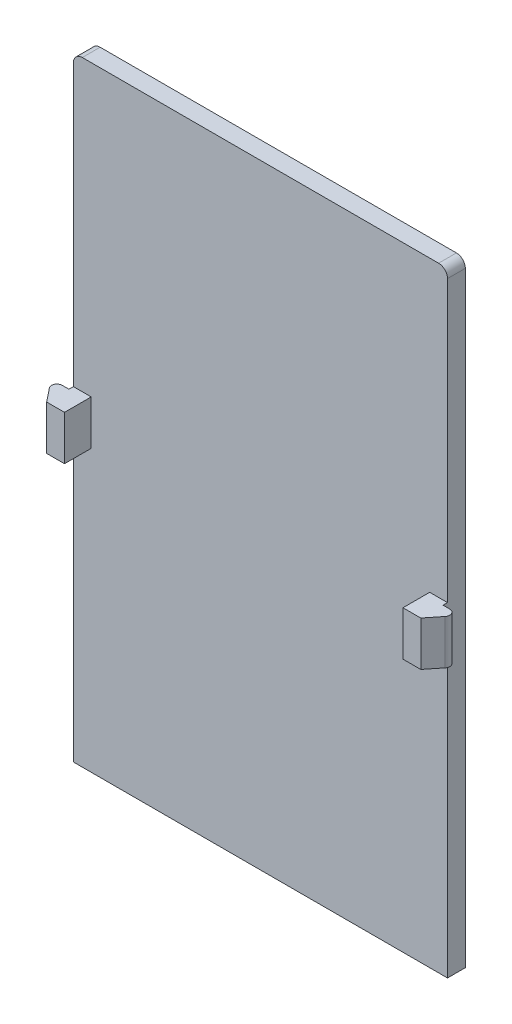
ISO-10303-21;
HEADER;
FILE_DESCRIPTION(('STEP AP214'),'2;1');
FILE_NAME('part.step','',(''),(''),'','','');
FILE_SCHEMA(('AUTOMOTIVE_DESIGN { 1 0 10303 214 1 1 1 1 }'));
ENDSEC;
DATA;
#1=APPLICATION_CONTEXT('core data for automotive mechanical design processes');
#2=APPLICATION_PROTOCOL_DEFINITION('international standard','automotive_design',2000,#1);
#3=PRODUCT_CONTEXT('',#1,'mechanical');
#4=PRODUCT('Part','Part','',(#3));
#5=PRODUCT_RELATED_PRODUCT_CATEGORY('part','',(#4));
#6=PRODUCT_DEFINITION_FORMATION('','',#4);
#7=PRODUCT_DEFINITION_CONTEXT('part definition',#1,'design');
#8=PRODUCT_DEFINITION('design','',#6,#7);
#9=PRODUCT_DEFINITION_SHAPE('','',#8);
#10=(LENGTH_UNIT() NAMED_UNIT(*) SI_UNIT(.MILLI.,.METRE.));
#11=(NAMED_UNIT(*) PLANE_ANGLE_UNIT() SI_UNIT($,.RADIAN.));
#12=(NAMED_UNIT(*) SI_UNIT($,.STERADIAN.) SOLID_ANGLE_UNIT());
#13=UNCERTAINTY_MEASURE_WITH_UNIT(LENGTH_MEASURE(1.E-05),#10,'distance_accuracy_value','');
#14=(GEOMETRIC_REPRESENTATION_CONTEXT(3) GLOBAL_UNCERTAINTY_ASSIGNED_CONTEXT((#13)) GLOBAL_UNIT_ASSIGNED_CONTEXT((#10,
#11,#12)) REPRESENTATION_CONTEXT('',''));
#15=CARTESIAN_POINT('',(0.,0.,0.));
#16=DIRECTION('',(0.,0.,1.));
#17=DIRECTION('',(1.,0.,0.));
#18=AXIS2_PLACEMENT_3D('',#15,#16,#17);
#19=CARTESIAN_POINT('',(0.,0.,2.));
#20=DIRECTION('',(0.,0.,1.));
#21=DIRECTION('',(1.,0.,0.));
#22=AXIS2_PLACEMENT_3D('',#19,#20,#21);
#23=PLANE('',#22);
#24=DIRECTION('',(0.,1.,0.));
#25=VECTOR('',#24,1.);
#26=CARTESIAN_POINT('',(44.,-71.,2.));
#27=LINE('',#26,#25);
#28=CARTESIAN_POINT('',(44.,-34.5,2.));
#29=VERTEX_POINT('',#28);
#30=CARTESIAN_POINT('',(44.,-3.,2.));
#31=VERTEX_POINT('',#30);
#32=EDGE_CURVE('E207',#29,#31,#27,.T.);
#33=ORIENTED_EDGE('',*,*,#32,.T.);
#34=CARTESIAN_POINT('',(43.,-3.,2.));
#35=DIRECTION('',(0.,0.,1.));
#36=DIRECTION('',(1.,0.,0.));
#37=AXIS2_PLACEMENT_3D('',#34,#35,#36);
#38=CIRCLE('',#37,1.);
#39=CARTESIAN_POINT('',(43.,-2.,2.));
#40=VERTEX_POINT('',#39);
#41=EDGE_CURVE('E273',#31,#40,#38,.T.);
#42=ORIENTED_EDGE('',*,*,#41,.T.);
#43=DIRECTION('',(-1.,0.,0.));
#44=VECTOR('',#43,1.);
#45=CARTESIAN_POINT('',(44.,-2.,2.));
#46=LINE('',#45,#44);
#47=CARTESIAN_POINT('',(3.,-2.00000000000001,2.));
#48=VERTEX_POINT('',#47);
#49=EDGE_CURVE('E211',#40,#48,#46,.T.);
#50=ORIENTED_EDGE('',*,*,#49,.T.);
#51=CARTESIAN_POINT('',(3.,-3.00000000000001,2.));
#52=DIRECTION('',(0.,0.,1.));
#53=DIRECTION('',(1.,0.,0.));
#54=AXIS2_PLACEMENT_3D('',#51,#52,#53);
#55=CIRCLE('',#54,1.);
#56=CARTESIAN_POINT('',(2.,-3.,2.));
#57=VERTEX_POINT('',#56);
#58=EDGE_CURVE('E271',#48,#57,#55,.T.);
#59=ORIENTED_EDGE('',*,*,#58,.T.);
#60=DIRECTION('',(0.,-1.,0.));
#61=VECTOR('',#60,1.);
#62=CARTESIAN_POINT('',(2.,-71.,2.));
#63=LINE('',#62,#61);
#64=CARTESIAN_POINT('',(2.,-34.5,2.));
#65=VERTEX_POINT('',#64);
#66=EDGE_CURVE('E215',#57,#65,#63,.T.);
#67=ORIENTED_EDGE('',*,*,#66,.T.);
#68=DIRECTION('',(-1.,0.,0.));
#69=VECTOR('',#68,1.);
#70=CARTESIAN_POINT('',(2.,-34.5,2.));
#71=LINE('',#70,#69);
#72=CARTESIAN_POINT('',(4.,-34.5,2.));
#73=VERTEX_POINT('',#72);
#74=EDGE_CURVE('E242',#73,#65,#71,.T.);
#75=ORIENTED_EDGE('',*,*,#74,.F.);
#76=DIRECTION('',(0.,1.,0.));
#77=VECTOR('',#76,1.);
#78=CARTESIAN_POINT('',(4.,-34.5,2.));
#79=LINE('',#78,#77);
#80=CARTESIAN_POINT('',(4.,-39.5,2.));
#81=VERTEX_POINT('',#80);
#82=EDGE_CURVE('E245',#81,#73,#79,.T.);
#83=ORIENTED_EDGE('',*,*,#82,.F.);
#84=DIRECTION('',(1.,0.,0.));
#85=VECTOR('',#84,1.);
#86=CARTESIAN_POINT('',(2.,-39.5,2.));
#87=LINE('',#86,#85);
#88=CARTESIAN_POINT('',(2.,-39.5,2.));
#89=VERTEX_POINT('',#88);
#90=EDGE_CURVE('E236',#89,#81,#87,.T.);
#91=ORIENTED_EDGE('',*,*,#90,.F.);
#92=CARTESIAN_POINT('',(2.,-71.,2.));
#93=VERTEX_POINT('',#92);
#94=EDGE_CURVE('E214',#89,#93,#63,.T.);
#95=ORIENTED_EDGE('',*,*,#94,.T.);
#96=DIRECTION('',(1.,0.,0.));
#97=VECTOR('',#96,1.);
#98=CARTESIAN_POINT('',(44.,-71.,2.));
#99=LINE('',#98,#97);
#100=CARTESIAN_POINT('',(44.,-71.,2.));
#101=VERTEX_POINT('',#100);
#102=EDGE_CURVE('E204',#93,#101,#99,.T.);
#103=ORIENTED_EDGE('',*,*,#102,.T.);
#104=CARTESIAN_POINT('',(44.,-39.5,2.));
#105=VERTEX_POINT('',#104);
#106=EDGE_CURVE('E208',#101,#105,#27,.T.);
#107=ORIENTED_EDGE('',*,*,#106,.T.);
#108=DIRECTION('',(1.,0.,0.));
#109=VECTOR('',#108,1.);
#110=CARTESIAN_POINT('',(42.,-39.5,2.));
#111=LINE('',#110,#109);
#112=CARTESIAN_POINT('',(42.,-39.5,2.));
#113=VERTEX_POINT('',#112);
#114=EDGE_CURVE('E231',#113,#105,#111,.T.);
#115=ORIENTED_EDGE('',*,*,#114,.F.);
#116=DIRECTION('',(0.,-1.,0.));
#117=VECTOR('',#116,1.);
#118=CARTESIAN_POINT('',(42.,-34.5,2.));
#119=LINE('',#118,#117);
#120=CARTESIAN_POINT('',(42.,-34.5,2.));
#121=VERTEX_POINT('',#120);
#122=EDGE_CURVE('E234',#121,#113,#119,.T.);
#123=ORIENTED_EDGE('',*,*,#122,.F.);
#124=DIRECTION('',(-1.,0.,0.));
#125=VECTOR('',#124,1.);
#126=CARTESIAN_POINT('',(42.,-34.5,2.));
#127=LINE('',#126,#125);
#128=EDGE_CURVE('E185',#29,#121,#127,.T.);
#129=ORIENTED_EDGE('',*,*,#128,.F.);
#130=EDGE_LOOP('',(#33,#42,#50,#59,#67,#75,#83,#91,#95,#103,#107,#115,#123,#129));
#131=FACE_BOUND('',#130,.T.);
#132=ADVANCED_FACE('F38',(#131),#23,.T.);
#133=CARTESIAN_POINT('',(2.,-34.5,5.));
#134=DIRECTION('',(1.,0.,0.));
#135=DIRECTION('',(0.,1.,0.));
#136=AXIS2_PLACEMENT_3D('',#133,#134,#135);
#137=PLANE('',#136);
#138=DIRECTION('',(0.,0.,-1.));
#139=VECTOR('',#138,1.);
#140=CARTESIAN_POINT('',(2.,-39.5,5.));
#141=LINE('',#140,#139);
#142=CARTESIAN_POINT('',(2.,-39.5,2.5));
#143=VERTEX_POINT('',#142);
#144=EDGE_CURVE('E255',#143,#89,#141,.T.);
#145=ORIENTED_EDGE('',*,*,#144,.F.);
#146=DIRECTION('',(0.,1.,0.));
#147=VECTOR('',#146,1.);
#148=CARTESIAN_POINT('',(2.,-34.5,2.5));
#149=LINE('',#148,#147);
#150=CARTESIAN_POINT('',(2.,-34.5,2.5));
#151=VERTEX_POINT('',#150);
#152=EDGE_CURVE('E195',#143,#151,#149,.T.);
#153=ORIENTED_EDGE('',*,*,#152,.T.);
#154=DIRECTION('',(0.,0.,-1.));
#155=VECTOR('',#154,1.);
#156=CARTESIAN_POINT('',(2.,-34.5,5.));
#157=LINE('',#156,#155);
#158=EDGE_CURVE('E241',#151,#65,#157,.T.);
#159=ORIENTED_EDGE('',*,*,#158,.T.);
#160=ORIENTED_EDGE('',*,*,#66,.F.);
#161=DIRECTION('',(0.,0.,1.));
#162=VECTOR('',#161,1.);
#163=CARTESIAN_POINT('',(1.99999999999999,-3.00000000000001,0.));
#164=LINE('',#163,#162);
#165=CARTESIAN_POINT('',(2.,-3.00000000000001,0.));
#166=VERTEX_POINT('',#165);
#167=EDGE_CURVE('E284',#57,#166,#164,.F.);
#168=ORIENTED_EDGE('',*,*,#167,.T.);
#169=DIRECTION('',(0.,-1.,0.));
#170=VECTOR('',#169,1.);
#171=CARTESIAN_POINT('',(2.,0.,0.));
#172=LINE('',#171,#170);
#173=CARTESIAN_POINT('',(2.,-71.,0.));
#174=VERTEX_POINT('',#173);
#175=EDGE_CURVE('E263',#166,#174,#172,.T.);
#176=ORIENTED_EDGE('',*,*,#175,.T.);
#177=DIRECTION('',(0.,0.,1.));
#178=VECTOR('',#177,1.);
#179=CARTESIAN_POINT('',(2.,-71.,-8.));
#180=LINE('',#179,#178);
#181=EDGE_CURVE('E219',#174,#93,#180,.T.);
#182=ORIENTED_EDGE('',*,*,#181,.T.);
#183=ORIENTED_EDGE('',*,*,#94,.F.);
#184=EDGE_LOOP('',(#145,#153,#159,#160,#168,#176,#182,#183));
#185=FACE_BOUND('',#184,.T.);
#186=ADVANCED_FACE('F362',(#185),#137,.F.);
#187=CARTESIAN_POINT('',(2.,-39.5,5.));
#188=DIRECTION('',(0.,1.,0.));
#189=DIRECTION('',(0.,0.,1.));
#190=AXIS2_PLACEMENT_3D('',#187,#188,#189);
#191=PLANE('',#190);
#192=DIRECTION('',(-0.624695047554424,0.,-0.78086880944303));
#193=VECTOR('',#192,1.);
#194=CARTESIAN_POINT('',(0.,-39.5,2.5));
#195=LINE('',#194,#193);
#196=CARTESIAN_POINT('',(2.,-39.5,5.));
#197=VERTEX_POINT('',#196);
#198=CARTESIAN_POINT('',(0.779853622826124,-39.5,3.47481702853265));
#199=VERTEX_POINT('',#198);
#200=EDGE_CURVE('E310',#197,#199,#195,.T.);
#201=ORIENTED_EDGE('',*,*,#200,.T.);
#202=CARTESIAN_POINT('',(1.24837490849194,-39.5,3.1));
#203=DIRECTION('',(0.,1.,0.));
#204=DIRECTION('',(0.,0.,1.));
#205=AXIS2_PLACEMENT_3D('',#202,#203,#204);
#206=CIRCLE('',#205,0.6);
#207=CARTESIAN_POINT('',(1.24837490849194,-39.5,2.5));
#208=VERTEX_POINT('',#207);
#209=EDGE_CURVE('E289',#199,#208,#206,.F.);
#210=ORIENTED_EDGE('',*,*,#209,.T.);
#211=DIRECTION('',(1.,0.,0.));
#212=VECTOR('',#211,1.);
#213=CARTESIAN_POINT('',(2.,-39.5,2.5));
#214=LINE('',#213,#212);
#215=EDGE_CURVE('E318',#208,#143,#214,.T.);
#216=ORIENTED_EDGE('',*,*,#215,.T.);
#217=ORIENTED_EDGE('',*,*,#144,.T.);
#218=ORIENTED_EDGE('',*,*,#90,.T.);
#219=DIRECTION('',(0.,0.,-1.));
#220=VECTOR('',#219,1.);
#221=CARTESIAN_POINT('',(4.,-39.5,5.));
#222=LINE('',#221,#220);
#223=CARTESIAN_POINT('',(4.,-39.5,5.));
#224=VERTEX_POINT('',#223);
#225=EDGE_CURVE('E253',#224,#81,#222,.T.);
#226=ORIENTED_EDGE('',*,*,#225,.F.);
#227=DIRECTION('',(1.,0.,0.));
#228=VECTOR('',#227,1.);
#229=CARTESIAN_POINT('',(4.,-39.5,5.));
#230=LINE('',#229,#228);
#231=EDGE_CURVE('E191',#197,#224,#230,.T.);
#232=ORIENTED_EDGE('',*,*,#231,.F.);
#233=EDGE_LOOP('',(#201,#210,#216,#217,#218,#226,#232));
#234=FACE_BOUND('',#233,.T.);
#235=ADVANCED_FACE('F334',(#234),#191,.F.);
#236=CARTESIAN_POINT('',(4.,-34.5,5.));
#237=DIRECTION('',(-1.,0.,0.));
#238=DIRECTION('',(0.,-1.,0.));
#239=AXIS2_PLACEMENT_3D('',#236,#237,#238);
#240=PLANE('',#239);
#241=ORIENTED_EDGE('',*,*,#82,.T.);
#242=DIRECTION('',(0.,0.,-1.));
#243=VECTOR('',#242,1.);
#244=CARTESIAN_POINT('',(4.,-34.5,5.));
#245=LINE('',#244,#243);
#246=CARTESIAN_POINT('',(4.,-34.5,5.));
#247=VERTEX_POINT('',#246);
#248=EDGE_CURVE('E251',#247,#73,#245,.T.);
#249=ORIENTED_EDGE('',*,*,#248,.F.);
#250=DIRECTION('',(0.,-1.,0.));
#251=VECTOR('',#250,1.);
#252=CARTESIAN_POINT('',(4.,-29.5,5.));
#253=LINE('',#252,#251);
#254=EDGE_CURVE('E193',#247,#224,#253,.T.);
#255=ORIENTED_EDGE('',*,*,#254,.T.);
#256=ORIENTED_EDGE('',*,*,#225,.T.);
#257=EDGE_LOOP('',(#241,#249,#255,#256));
#258=FACE_BOUND('',#257,.T.);
#259=ADVANCED_FACE('F329',(#258),#240,.F.);
#260=CARTESIAN_POINT('',(2.,-34.5,5.));
#261=DIRECTION('',(0.,-1.,0.));
#262=DIRECTION('',(0.,0.,-1.));
#263=AXIS2_PLACEMENT_3D('',#260,#261,#262);
#264=PLANE('',#263);
#265=DIRECTION('',(-1.,0.,0.));
#266=VECTOR('',#265,1.);
#267=CARTESIAN_POINT('',(2.,-34.5,2.5));
#268=LINE('',#267,#266);
#269=CARTESIAN_POINT('',(1.24837490849194,-34.5,2.5));
#270=VERTEX_POINT('',#269);
#271=EDGE_CURVE('E317',#151,#270,#268,.T.);
#272=ORIENTED_EDGE('',*,*,#271,.T.);
#273=CARTESIAN_POINT('',(1.24837490849194,-34.5,3.1));
#274=DIRECTION('',(0.,-1.,0.));
#275=DIRECTION('',(0.,0.,-1.));
#276=AXIS2_PLACEMENT_3D('',#273,#274,#275);
#277=CIRCLE('',#276,0.6);
#278=CARTESIAN_POINT('',(0.779853622826124,-34.5,3.47481702853265));
#279=VERTEX_POINT('',#278);
#280=EDGE_CURVE('E293',#270,#279,#277,.F.);
#281=ORIENTED_EDGE('',*,*,#280,.T.);
#282=DIRECTION('',(0.624695047554424,0.,0.78086880944303));
#283=VECTOR('',#282,1.);
#284=CARTESIAN_POINT('',(0.,-34.5,2.5));
#285=LINE('',#284,#283);
#286=CARTESIAN_POINT('',(2.,-34.5,5.));
#287=VERTEX_POINT('',#286);
#288=EDGE_CURVE('E315',#279,#287,#285,.T.);
#289=ORIENTED_EDGE('',*,*,#288,.T.);
#290=DIRECTION('',(1.,0.,0.));
#291=VECTOR('',#290,1.);
#292=CARTESIAN_POINT('',(2.,-34.5,5.));
#293=LINE('',#292,#291);
#294=EDGE_CURVE('E201',#287,#247,#293,.T.);
#295=ORIENTED_EDGE('',*,*,#294,.T.);
#296=ORIENTED_EDGE('',*,*,#248,.T.);
#297=ORIENTED_EDGE('',*,*,#74,.T.);
#298=ORIENTED_EDGE('',*,*,#158,.F.);
#299=EDGE_LOOP('',(#272,#281,#289,#295,#296,#297,#298));
#300=FACE_BOUND('',#299,.T.);
#301=ADVANCED_FACE('F346',(#300),#264,.F.);
#302=CARTESIAN_POINT('',(42.,-34.5,5.));
#303=DIRECTION('',(1.,0.,0.));
#304=DIRECTION('',(0.,0.,-1.));
#305=AXIS2_PLACEMENT_3D('',#302,#303,#304);
#306=PLANE('',#305);
#307=ORIENTED_EDGE('',*,*,#122,.T.);
#308=DIRECTION('',(0.,0.,-1.));
#309=VECTOR('',#308,1.);
#310=CARTESIAN_POINT('',(42.,-39.5,5.));
#311=LINE('',#310,#309);
#312=CARTESIAN_POINT('',(42.,-39.5,5.));
#313=VERTEX_POINT('',#312);
#314=EDGE_CURVE('E221',#313,#113,#311,.T.);
#315=ORIENTED_EDGE('',*,*,#314,.F.);
#316=DIRECTION('',(0.,-1.,0.));
#317=VECTOR('',#316,1.);
#318=CARTESIAN_POINT('',(42.,-29.5,5.));
#319=LINE('',#318,#317);
#320=CARTESIAN_POINT('',(42.,-34.5,5.));
#321=VERTEX_POINT('',#320);
#322=EDGE_CURVE('E190',#321,#313,#319,.T.);
#323=ORIENTED_EDGE('',*,*,#322,.F.);
#324=DIRECTION('',(0.,0.,-1.));
#325=VECTOR('',#324,1.);
#326=CARTESIAN_POINT('',(42.,-34.5,5.));
#327=LINE('',#326,#325);
#328=EDGE_CURVE('E186',#321,#121,#327,.T.);
#329=ORIENTED_EDGE('',*,*,#328,.T.);
#330=EDGE_LOOP('',(#307,#315,#323,#329));
#331=FACE_BOUND('',#330,.T.);
#332=ADVANCED_FACE('F419',(#331),#306,.F.);
#333=CARTESIAN_POINT('',(42.,-39.5,5.));
#334=DIRECTION('',(0.,1.,0.));
#335=DIRECTION('',(0.,0.,1.));
#336=AXIS2_PLACEMENT_3D('',#333,#334,#335);
#337=PLANE('',#336);
#338=DIRECTION('',(1.,0.,0.));
#339=VECTOR('',#338,1.);
#340=CARTESIAN_POINT('',(42.,-39.5,2.5));
#341=LINE('',#340,#339);
#342=CARTESIAN_POINT('',(44.,-39.5,2.5));
#343=VERTEX_POINT('',#342);
#344=CARTESIAN_POINT('',(44.7516250915081,-39.5,2.5));
#345=VERTEX_POINT('',#344);
#346=EDGE_CURVE('E177',#343,#345,#341,.T.);
#347=ORIENTED_EDGE('',*,*,#346,.T.);
#348=CARTESIAN_POINT('',(44.7516250915081,-39.5,3.1));
#349=DIRECTION('',(0.,1.,0.));
#350=DIRECTION('',(0.,0.,1.));
#351=AXIS2_PLACEMENT_3D('',#348,#349,#350);
#352=CIRCLE('',#351,0.6);
#353=CARTESIAN_POINT('',(45.2201463771739,-39.5,3.47481702853266));
#354=VERTEX_POINT('',#353);
#355=EDGE_CURVE('E60',#345,#354,#352,.F.);
#356=ORIENTED_EDGE('',*,*,#355,.T.);
#357=DIRECTION('',(-0.624695047554425,0.,0.780868809443029));
#358=VECTOR('',#357,1.);
#359=CARTESIAN_POINT('',(46.,-39.5,2.5));
#360=LINE('',#359,#358);
#361=CARTESIAN_POINT('',(44.,-39.5,5.));
#362=VERTEX_POINT('',#361);
#363=EDGE_CURVE('E171',#354,#362,#360,.T.);
#364=ORIENTED_EDGE('',*,*,#363,.T.);
#365=DIRECTION('',(1.,0.,0.));
#366=VECTOR('',#365,1.);
#367=CARTESIAN_POINT('',(42.,-39.5,5.));
#368=LINE('',#367,#366);
#369=EDGE_CURVE('E175',#313,#362,#368,.T.);
#370=ORIENTED_EDGE('',*,*,#369,.F.);
#371=ORIENTED_EDGE('',*,*,#314,.T.);
#372=ORIENTED_EDGE('',*,*,#114,.T.);
#373=DIRECTION('',(0.,0.,-1.));
#374=VECTOR('',#373,1.);
#375=CARTESIAN_POINT('',(44.,-39.5,5.));
#376=LINE('',#375,#374);
#377=EDGE_CURVE('E224',#343,#105,#376,.T.);
#378=ORIENTED_EDGE('',*,*,#377,.F.);
#379=EDGE_LOOP('',(#347,#356,#364,#370,#371,#372,#378));
#380=FACE_BOUND('',#379,.T.);
#381=ADVANCED_FACE('F173',(#380),#337,.F.);
#382=CARTESIAN_POINT('',(44.,-34.5,5.));
#383=DIRECTION('',(-1.,0.,0.));
#384=DIRECTION('',(0.,0.,1.));
#385=AXIS2_PLACEMENT_3D('',#382,#383,#384);
#386=PLANE('',#385);
#387=DIRECTION('',(0.,0.,-1.));
#388=VECTOR('',#387,1.);
#389=CARTESIAN_POINT('',(44.,-34.5,5.));
#390=LINE('',#389,#388);
#391=CARTESIAN_POINT('',(44.,-34.5,2.5));
#392=VERTEX_POINT('',#391);
#393=EDGE_CURVE('E226',#392,#29,#390,.T.);
#394=ORIENTED_EDGE('',*,*,#393,.F.);
#395=DIRECTION('',(0.,-1.,0.));
#396=VECTOR('',#395,1.);
#397=CARTESIAN_POINT('',(44.,-34.5,2.5));
#398=LINE('',#397,#396);
#399=EDGE_CURVE('E308',#392,#343,#398,.T.);
#400=ORIENTED_EDGE('',*,*,#399,.T.);
#401=ORIENTED_EDGE('',*,*,#377,.T.);
#402=ORIENTED_EDGE('',*,*,#106,.F.);
#403=DIRECTION('',(0.,0.,1.));
#404=VECTOR('',#403,1.);
#405=CARTESIAN_POINT('',(44.,-71.,-8.));
#406=LINE('',#405,#404);
#407=CARTESIAN_POINT('',(44.,-71.,0.));
#408=VERTEX_POINT('',#407);
#409=EDGE_CURVE('E218',#408,#101,#406,.T.);
#410=ORIENTED_EDGE('',*,*,#409,.F.);
#411=DIRECTION('',(0.,1.,0.));
#412=VECTOR('',#411,1.);
#413=CARTESIAN_POINT('',(44.,0.,0.));
#414=LINE('',#413,#412);
#415=CARTESIAN_POINT('',(44.,-3.,0.));
#416=VERTEX_POINT('',#415);
#417=EDGE_CURVE('E257',#408,#416,#414,.T.);
#418=ORIENTED_EDGE('',*,*,#417,.T.);
#419=DIRECTION('',(0.,0.,1.));
#420=VECTOR('',#419,1.);
#421=CARTESIAN_POINT('',(44.,-3.,2.));
#422=LINE('',#421,#420);
#423=EDGE_CURVE('E268',#416,#31,#422,.T.);
#424=ORIENTED_EDGE('',*,*,#423,.T.);
#425=ORIENTED_EDGE('',*,*,#32,.F.);
#426=EDGE_LOOP('',(#394,#400,#401,#402,#410,#418,#424,#425));
#427=FACE_BOUND('',#426,.T.);
#428=ADVANCED_FACE('F373',(#427),#386,.F.);
#429=CARTESIAN_POINT('',(42.,-34.5,5.));
#430=DIRECTION('',(0.,-1.,0.));
#431=DIRECTION('',(0.,0.,-1.));
#432=AXIS2_PLACEMENT_3D('',#429,#430,#431);
#433=PLANE('',#432);
#434=DIRECTION('',(0.624695047554425,0.,-0.780868809443029));
#435=VECTOR('',#434,1.);
#436=CARTESIAN_POINT('',(46.,-34.5,2.5));
#437=LINE('',#436,#435);
#438=CARTESIAN_POINT('',(44.,-34.5,5.));
#439=VERTEX_POINT('',#438);
#440=CARTESIAN_POINT('',(45.2201463771739,-34.5,3.47481702853266));
#441=VERTEX_POINT('',#440);
#442=EDGE_CURVE('E178',#439,#441,#437,.T.);
#443=ORIENTED_EDGE('',*,*,#442,.T.);
#444=CARTESIAN_POINT('',(44.7516250915081,-34.5,3.1));
#445=DIRECTION('',(0.,-1.,0.));
#446=DIRECTION('',(0.,0.,-1.));
#447=AXIS2_PLACEMENT_3D('',#444,#445,#446);
#448=CIRCLE('',#447,0.6);
#449=CARTESIAN_POINT('',(44.7516250915081,-34.5,2.5));
#450=VERTEX_POINT('',#449);
#451=EDGE_CURVE('E11',#441,#450,#448,.F.);
#452=ORIENTED_EDGE('',*,*,#451,.T.);
#453=DIRECTION('',(-1.,0.,0.));
#454=VECTOR('',#453,1.);
#455=CARTESIAN_POINT('',(42.,-34.5,2.5));
#456=LINE('',#455,#454);
#457=EDGE_CURVE('E304',#450,#392,#456,.T.);
#458=ORIENTED_EDGE('',*,*,#457,.T.);
#459=ORIENTED_EDGE('',*,*,#393,.T.);
#460=ORIENTED_EDGE('',*,*,#128,.T.);
#461=ORIENTED_EDGE('',*,*,#328,.F.);
#462=DIRECTION('',(1.,0.,0.));
#463=VECTOR('',#462,1.);
#464=CARTESIAN_POINT('',(42.,-34.5,5.));
#465=LINE('',#464,#463);
#466=EDGE_CURVE('E199',#321,#439,#465,.T.);
#467=ORIENTED_EDGE('',*,*,#466,.T.);
#468=EDGE_LOOP('',(#443,#452,#458,#459,#460,#461,#467));
#469=FACE_BOUND('',#468,.T.);
#470=ADVANCED_FACE('F377',(#469),#433,.F.);
#471=CARTESIAN_POINT('',(44.,-71.,-8.));
#472=DIRECTION('',(0.,-1.,0.));
#473=DIRECTION('',(0.,0.,-1.));
#474=AXIS2_PLACEMENT_3D('',#471,#472,#473);
#475=PLANE('',#474);
#476=DIRECTION('',(1.,0.,0.));
#477=VECTOR('',#476,1.);
#478=CARTESIAN_POINT('',(0.,-71.,0.));
#479=LINE('',#478,#477);
#480=EDGE_CURVE('E265',#174,#408,#479,.T.);
#481=ORIENTED_EDGE('',*,*,#480,.T.);
#482=ORIENTED_EDGE('',*,*,#409,.T.);
#483=ORIENTED_EDGE('',*,*,#102,.F.);
#484=ORIENTED_EDGE('',*,*,#181,.F.);
#485=EDGE_LOOP('',(#481,#482,#483,#484));
#486=FACE_BOUND('',#485,.T.);
#487=ADVANCED_FACE('F368',(#486),#475,.T.);
#488=CARTESIAN_POINT('',(44.,-2.,-8.));
#489=DIRECTION('',(0.,1.,0.));
#490=DIRECTION('',(-1.,0.,0.));
#491=AXIS2_PLACEMENT_3D('',#488,#489,#490);
#492=PLANE('',#491);
#493=ORIENTED_EDGE('',*,*,#49,.F.);
#494=DIRECTION('',(0.,0.,1.));
#495=VECTOR('',#494,1.);
#496=CARTESIAN_POINT('',(43.,-2.,0.));
#497=LINE('',#496,#495);
#498=CARTESIAN_POINT('',(43.,-2.,0.));
#499=VERTEX_POINT('',#498);
#500=EDGE_CURVE('E278',#40,#499,#497,.F.);
#501=ORIENTED_EDGE('',*,*,#500,.T.);
#502=DIRECTION('',(-1.,0.,0.));
#503=VECTOR('',#502,1.);
#504=CARTESIAN_POINT('',(0.,-2.00000000000001,0.));
#505=LINE('',#504,#503);
#506=CARTESIAN_POINT('',(3.,-2.,0.));
#507=VERTEX_POINT('',#506);
#508=EDGE_CURVE('E260',#499,#507,#505,.T.);
#509=ORIENTED_EDGE('',*,*,#508,.T.);
#510=DIRECTION('',(0.,0.,1.));
#511=VECTOR('',#510,1.);
#512=CARTESIAN_POINT('',(3.,-2.00000000000001,2.));
#513=LINE('',#512,#511);
#514=EDGE_CURVE('E275',#507,#48,#513,.T.);
#515=ORIENTED_EDGE('',*,*,#514,.T.);
#516=EDGE_LOOP('',(#493,#501,#509,#515));
#517=FACE_BOUND('',#516,.T.);
#518=ADVANCED_FACE('F396',(#517),#492,.T.);
#519=CARTESIAN_POINT('',(0.,0.,0.));
#520=DIRECTION('',(0.,0.,1.));
#521=DIRECTION('',(1.,0.,0.));
#522=AXIS2_PLACEMENT_3D('',#519,#520,#521);
#523=PLANE('',#522);
#524=ORIENTED_EDGE('',*,*,#508,.F.);
#525=CARTESIAN_POINT('',(43.,-3.,0.));
#526=DIRECTION('',(0.,0.,1.));
#527=DIRECTION('',(1.,0.,0.));
#528=AXIS2_PLACEMENT_3D('',#525,#526,#527);
#529=CIRCLE('',#528,1.);
#530=EDGE_CURVE('E282',#499,#416,#529,.F.);
#531=ORIENTED_EDGE('',*,*,#530,.T.);
#532=ORIENTED_EDGE('',*,*,#417,.F.);
#533=ORIENTED_EDGE('',*,*,#480,.F.);
#534=ORIENTED_EDGE('',*,*,#175,.F.);
#535=CARTESIAN_POINT('',(3.,-3.00000000000001,0.));
#536=DIRECTION('',(0.,0.,1.));
#537=DIRECTION('',(1.,0.,0.));
#538=AXIS2_PLACEMENT_3D('',#535,#536,#537);
#539=CIRCLE('',#538,1.);
#540=EDGE_CURVE('E280',#166,#507,#539,.F.);
#541=ORIENTED_EDGE('',*,*,#540,.T.);
#542=EDGE_LOOP('',(#524,#531,#532,#533,#534,#541));
#543=FACE_BOUND('',#542,.T.);
#544=ADVANCED_FACE('F392',(#543),#523,.F.);
#545=CARTESIAN_POINT('',(43.,-3.,5.));
#546=DIRECTION('',(0.,0.,-1.));
#547=DIRECTION('',(-1.,0.,0.));
#548=AXIS2_PLACEMENT_3D('',#545,#546,#547);
#549=CYLINDRICAL_SURFACE('',#548,1.);
#550=ORIENTED_EDGE('',*,*,#530,.F.);
#551=ORIENTED_EDGE('',*,*,#500,.F.);
#552=ORIENTED_EDGE('',*,*,#41,.F.);
#553=ORIENTED_EDGE('',*,*,#423,.F.);
#554=EDGE_LOOP('',(#550,#551,#552,#553));
#555=FACE_BOUND('',#554,.T.);
#556=ADVANCED_FACE('F395',(#555),#549,.T.);
#557=CARTESIAN_POINT('',(3.,-3.00000000000001,-8.));
#558=DIRECTION('',(0.,0.,-1.));
#559=DIRECTION('',(-1.,0.,0.));
#560=AXIS2_PLACEMENT_3D('',#557,#558,#559);
#561=CYLINDRICAL_SURFACE('',#560,1.);
#562=ORIENTED_EDGE('',*,*,#540,.F.);
#563=ORIENTED_EDGE('',*,*,#167,.F.);
#564=ORIENTED_EDGE('',*,*,#58,.F.);
#565=ORIENTED_EDGE('',*,*,#514,.F.);
#566=EDGE_LOOP('',(#562,#563,#564,#565));
#567=FACE_BOUND('',#566,.T.);
#568=ADVANCED_FACE('F400',(#567),#561,.T.);
#569=CARTESIAN_POINT('',(42.,-29.5,5.));
#570=DIRECTION('',(0.,0.,-1.));
#571=DIRECTION('',(-1.,0.,0.));
#572=AXIS2_PLACEMENT_3D('',#569,#570,#571);
#573=PLANE('',#572);
#574=ORIENTED_EDGE('',*,*,#466,.F.);
#575=ORIENTED_EDGE('',*,*,#322,.T.);
#576=ORIENTED_EDGE('',*,*,#369,.T.);
#577=DIRECTION('',(0.,1.,0.));
#578=VECTOR('',#577,1.);
#579=CARTESIAN_POINT('',(44.,-34.5,5.));
#580=LINE('',#579,#578);
#581=EDGE_CURVE('E181',#362,#439,#580,.T.);
#582=ORIENTED_EDGE('',*,*,#581,.T.);
#583=EDGE_LOOP('',(#574,#575,#576,#582));
#584=FACE_BOUND('',#583,.T.);
#585=ADVANCED_FACE('F188',(#584),#573,.F.);
#586=CARTESIAN_POINT('',(4.,-29.5,5.));
#587=DIRECTION('',(0.,0.,-1.));
#588=DIRECTION('',(-1.,0.,0.));
#589=AXIS2_PLACEMENT_3D('',#586,#587,#588);
#590=PLANE('',#589);
#591=DIRECTION('',(0.,-1.,0.));
#592=VECTOR('',#591,1.);
#593=CARTESIAN_POINT('',(2.,-34.5,5.));
#594=LINE('',#593,#592);
#595=EDGE_CURVE('E238',#287,#197,#594,.T.);
#596=ORIENTED_EDGE('',*,*,#595,.T.);
#597=ORIENTED_EDGE('',*,*,#231,.T.);
#598=ORIENTED_EDGE('',*,*,#254,.F.);
#599=ORIENTED_EDGE('',*,*,#294,.F.);
#600=EDGE_LOOP('',(#596,#597,#598,#599));
#601=FACE_BOUND('',#600,.T.);
#602=ADVANCED_FACE('F349',(#601),#590,.F.);
#603=CARTESIAN_POINT('',(2.,-29.7830094339717,2.5));
#604=DIRECTION('',(0.,0.,-1.));
#605=DIRECTION('',(-1.,0.,0.));
#606=AXIS2_PLACEMENT_3D('',#603,#604,#605);
#607=PLANE('',#606);
#608=ORIENTED_EDGE('',*,*,#215,.F.);
#609=DIRECTION('',(0.,-1.,0.));
#610=VECTOR('',#609,1.);
#611=CARTESIAN_POINT('',(1.24837490849194,-29.7830094339717,2.5));
#612=LINE('',#611,#610);
#613=EDGE_CURVE('E291',#208,#270,#612,.F.);
#614=ORIENTED_EDGE('',*,*,#613,.T.);
#615=ORIENTED_EDGE('',*,*,#271,.F.);
#616=ORIENTED_EDGE('',*,*,#152,.F.);
#617=EDGE_LOOP('',(#608,#614,#615,#616));
#618=FACE_BOUND('',#617,.T.);
#619=ADVANCED_FACE('F358',(#618),#607,.T.);
#620=CARTESIAN_POINT('',(0.,-29.7830094339717,2.5));
#621=DIRECTION('',(-0.78086880944303,0.,0.624695047554424));
#622=DIRECTION('',(0.624695047554424,0.,0.78086880944303));
#623=AXIS2_PLACEMENT_3D('',#620,#621,#622);
#624=PLANE('',#623);
#625=ORIENTED_EDGE('',*,*,#288,.F.);
#626=DIRECTION('',(0.,-1.,0.));
#627=VECTOR('',#626,1.);
#628=CARTESIAN_POINT('',(0.779853622826124,-29.7830094339717,3.47481702853265));
#629=LINE('',#628,#627);
#630=EDGE_CURVE('E286',#279,#199,#629,.T.);
#631=ORIENTED_EDGE('',*,*,#630,.T.);
#632=ORIENTED_EDGE('',*,*,#200,.F.);
#633=ORIENTED_EDGE('',*,*,#595,.F.);
#634=EDGE_LOOP('',(#625,#631,#632,#633));
#635=FACE_BOUND('',#634,.T.);
#636=ADVANCED_FACE('F351',(#635),#624,.T.);
#637=CARTESIAN_POINT('',(42.,-29.7830094339717,2.5));
#638=DIRECTION('',(0.,0.,-1.));
#639=DIRECTION('',(-1.,0.,0.));
#640=AXIS2_PLACEMENT_3D('',#637,#638,#639);
#641=PLANE('',#640);
#642=ORIENTED_EDGE('',*,*,#457,.F.);
#643=DIRECTION('',(0.,-1.,0.));
#644=VECTOR('',#643,1.);
#645=CARTESIAN_POINT('',(44.7516250915081,-29.7830094339717,2.5));
#646=LINE('',#645,#644);
#647=EDGE_CURVE('E295',#450,#345,#646,.T.);
#648=ORIENTED_EDGE('',*,*,#647,.T.);
#649=ORIENTED_EDGE('',*,*,#346,.F.);
#650=ORIENTED_EDGE('',*,*,#399,.F.);
#651=EDGE_LOOP('',(#642,#648,#649,#650));
#652=FACE_BOUND('',#651,.T.);
#653=ADVANCED_FACE('F301',(#652),#641,.T.);
#654=CARTESIAN_POINT('',(46.,-29.7830094339717,2.5));
#655=DIRECTION('',(0.780868809443029,0.,0.624695047554425));
#656=DIRECTION('',(0.624695047554425,0.,-0.780868809443029));
#657=AXIS2_PLACEMENT_3D('',#654,#655,#656);
#658=PLANE('',#657);
#659=ORIENTED_EDGE('',*,*,#363,.F.);
#660=DIRECTION('',(0.,-1.,0.));
#661=VECTOR('',#660,1.);
#662=CARTESIAN_POINT('',(45.2201463771739,-29.7830094339717,3.47481702853266));
#663=LINE('',#662,#661);
#664=EDGE_CURVE('E46',#354,#441,#663,.F.);
#665=ORIENTED_EDGE('',*,*,#664,.T.);
#666=ORIENTED_EDGE('',*,*,#442,.F.);
#667=ORIENTED_EDGE('',*,*,#581,.F.);
#668=EDGE_LOOP('',(#659,#665,#666,#667));
#669=FACE_BOUND('',#668,.T.);
#670=ADVANCED_FACE('F182',(#669),#658,.T.);
#671=CARTESIAN_POINT('',(1.24837490849194,-29.7830094339717,3.1));
#672=DIRECTION('',(0.,-1.,0.));
#673=DIRECTION('',(0.,0.,-1.));
#674=AXIS2_PLACEMENT_3D('',#671,#672,#673);
#675=CYLINDRICAL_SURFACE('',#674,0.6);
#676=ORIENTED_EDGE('',*,*,#280,.F.);
#677=ORIENTED_EDGE('',*,*,#613,.F.);
#678=ORIENTED_EDGE('',*,*,#209,.F.);
#679=ORIENTED_EDGE('',*,*,#630,.F.);
#680=EDGE_LOOP('',(#676,#677,#678,#679));
#681=FACE_BOUND('',#680,.T.);
#682=ADVANCED_FACE('F360',(#681),#675,.T.);
#683=CARTESIAN_POINT('',(44.7516250915081,-29.7830094339717,3.1));
#684=DIRECTION('',(0.,-1.,0.));
#685=DIRECTION('',(0.,0.,-1.));
#686=AXIS2_PLACEMENT_3D('',#683,#684,#685);
#687=CYLINDRICAL_SURFACE('',#686,0.6);
#688=ORIENTED_EDGE('',*,*,#451,.F.);
#689=ORIENTED_EDGE('',*,*,#664,.F.);
#690=ORIENTED_EDGE('',*,*,#355,.F.);
#691=ORIENTED_EDGE('',*,*,#647,.F.);
#692=EDGE_LOOP('',(#688,#689,#690,#691));
#693=FACE_BOUND('',#692,.T.);
#694=ADVANCED_FACE('F40',(#693),#687,.T.);
#695=CLOSED_SHELL('',(#132,#186,#235,#259,#301,#332,#381,#428,#470,#487,#518,#544,#556,#568,
#585,#602,#619,#636,#653,#670,#682,#694));
#696=MANIFOLD_SOLID_BREP('B2',#695);
#697=ADVANCED_BREP_SHAPE_REPRESENTATION('',(#18,#696),#14);
#698=SHAPE_DEFINITION_REPRESENTATION(#9,#697);
ENDSEC;
END-ISO-10303-21;
